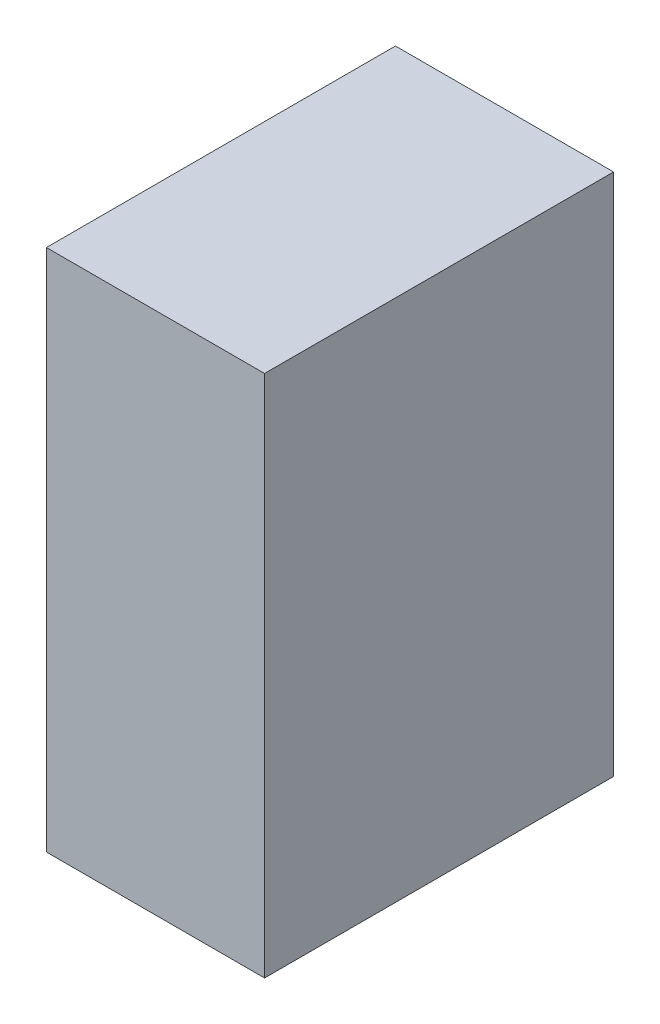
ISO-10303-21;
HEADER;
FILE_DESCRIPTION(('STEP AP214'),'2;1');
FILE_NAME('part.step','',(''),(''),'','','');
FILE_SCHEMA(('AUTOMOTIVE_DESIGN { 1 0 10303 214 1 1 1 1 }'));
ENDSEC;
DATA;
#1=APPLICATION_CONTEXT('core data for automotive mechanical design processes');
#2=APPLICATION_PROTOCOL_DEFINITION('international standard','automotive_design',2000,#1);
#3=PRODUCT_CONTEXT('',#1,'mechanical');
#4=PRODUCT('Part','Part','',(#3));
#5=PRODUCT_RELATED_PRODUCT_CATEGORY('part','',(#4));
#6=PRODUCT_DEFINITION_FORMATION('','',#4);
#7=PRODUCT_DEFINITION_CONTEXT('part definition',#1,'design');
#8=PRODUCT_DEFINITION('design','',#6,#7);
#9=PRODUCT_DEFINITION_SHAPE('','',#8);
#10=(LENGTH_UNIT() NAMED_UNIT(*) SI_UNIT(.MILLI.,.METRE.));
#11=(NAMED_UNIT(*) PLANE_ANGLE_UNIT() SI_UNIT($,.RADIAN.));
#12=(NAMED_UNIT(*) SI_UNIT($,.STERADIAN.) SOLID_ANGLE_UNIT());
#13=UNCERTAINTY_MEASURE_WITH_UNIT(LENGTH_MEASURE(1.E-05),#10,'distance_accuracy_value','');
#14=(GEOMETRIC_REPRESENTATION_CONTEXT(3) GLOBAL_UNCERTAINTY_ASSIGNED_CONTEXT((#13)) GLOBAL_UNIT_ASSIGNED_CONTEXT((#10,
#11,#12)) REPRESENTATION_CONTEXT('',''));
#15=CARTESIAN_POINT('',(0.,0.,0.));
#16=DIRECTION('',(0.,0.,1.));
#17=DIRECTION('',(1.,0.,0.));
#18=AXIS2_PLACEMENT_3D('',#15,#16,#17);
#19=CARTESIAN_POINT('',(0.,0.,0.4));
#20=DIRECTION('',(0.,1.,0.));
#21=DIRECTION('',(0.,0.,1.));
#22=AXIS2_PLACEMENT_3D('',#19,#20,#21);
#23=PLANE('',#22);
#24=DIRECTION('',(1.,0.,0.));
#25=VECTOR('',#24,1.);
#26=CARTESIAN_POINT('',(0.,0.,0.));
#27=LINE('',#26,#25);
#28=CARTESIAN_POINT('',(0.,0.,0.));
#29=VERTEX_POINT('',#28);
#30=CARTESIAN_POINT('',(0.25,0.,0.));
#31=VERTEX_POINT('',#30);
#32=EDGE_CURVE('E98',#29,#31,#27,.T.);
#33=ORIENTED_EDGE('',*,*,#32,.T.);
#34=DIRECTION('',(0.,0.,-1.));
#35=VECTOR('',#34,1.);
#36=CARTESIAN_POINT('',(0.25,0.,0.4));
#37=LINE('',#36,#35);
#38=CARTESIAN_POINT('',(0.25,0.,0.4));
#39=VERTEX_POINT('',#38);
#40=EDGE_CURVE('E11',#39,#31,#37,.T.);
#41=ORIENTED_EDGE('',*,*,#40,.F.);
#42=DIRECTION('',(1.,0.,0.));
#43=VECTOR('',#42,1.);
#44=CARTESIAN_POINT('',(0.,0.,0.4));
#45=LINE('',#44,#43);
#46=CARTESIAN_POINT('',(0.,0.,0.4));
#47=VERTEX_POINT('',#46);
#48=EDGE_CURVE('E84',#47,#39,#45,.T.);
#49=ORIENTED_EDGE('',*,*,#48,.F.);
#50=DIRECTION('',(0.,0.,-1.));
#51=VECTOR('',#50,1.);
#52=CARTESIAN_POINT('',(0.,0.,0.4));
#53=LINE('',#52,#51);
#54=EDGE_CURVE('E51',#47,#29,#53,.T.);
#55=ORIENTED_EDGE('',*,*,#54,.T.);
#56=EDGE_LOOP('',(#33,#41,#49,#55));
#57=FACE_BOUND('',#56,.T.);
#58=ADVANCED_FACE('F35',(#57),#23,.F.);
#59=CARTESIAN_POINT('',(0.25,0.,0.4));
#60=DIRECTION('',(-1.,0.,0.));
#61=DIRECTION('',(0.,0.,1.));
#62=AXIS2_PLACEMENT_3D('',#59,#60,#61);
#63=PLANE('',#62);
#64=DIRECTION('',(0.,1.,0.));
#65=VECTOR('',#64,1.);
#66=CARTESIAN_POINT('',(0.25,0.,0.));
#67=LINE('',#66,#65);
#68=CARTESIAN_POINT('',(0.25,0.6,0.));
#69=VERTEX_POINT('',#68);
#70=EDGE_CURVE('E89',#31,#69,#67,.T.);
#71=ORIENTED_EDGE('',*,*,#70,.T.);
#72=DIRECTION('',(0.,0.,-1.));
#73=VECTOR('',#72,1.);
#74=CARTESIAN_POINT('',(0.25,0.6,0.4));
#75=LINE('',#74,#73);
#76=CARTESIAN_POINT('',(0.25,0.6,0.4));
#77=VERTEX_POINT('',#76);
#78=EDGE_CURVE('E43',#77,#69,#75,.T.);
#79=ORIENTED_EDGE('',*,*,#78,.F.);
#80=DIRECTION('',(0.,1.,0.));
#81=VECTOR('',#80,1.);
#82=CARTESIAN_POINT('',(0.25,0.,0.4));
#83=LINE('',#82,#81);
#84=EDGE_CURVE('E76',#39,#77,#83,.T.);
#85=ORIENTED_EDGE('',*,*,#84,.F.);
#86=ORIENTED_EDGE('',*,*,#40,.T.);
#87=EDGE_LOOP('',(#71,#79,#85,#86));
#88=FACE_BOUND('',#87,.T.);
#89=ADVANCED_FACE('F88',(#88),#63,.F.);
#90=CARTESIAN_POINT('',(0.,0.6,0.4));
#91=DIRECTION('',(0.,1.,0.));
#92=DIRECTION('',(0.,0.,1.));
#93=AXIS2_PLACEMENT_3D('',#90,#91,#92);
#94=PLANE('',#93);
#95=DIRECTION('',(1.,0.,0.));
#96=VECTOR('',#95,1.);
#97=CARTESIAN_POINT('',(0.,0.6,0.));
#98=LINE('',#97,#96);
#99=CARTESIAN_POINT('',(0.,0.6,0.));
#100=VERTEX_POINT('',#99);
#101=EDGE_CURVE('E101',#100,#69,#98,.T.);
#102=ORIENTED_EDGE('',*,*,#101,.F.);
#103=DIRECTION('',(0.,0.,-1.));
#104=VECTOR('',#103,1.);
#105=CARTESIAN_POINT('',(0.,0.6,0.4));
#106=LINE('',#105,#104);
#107=CARTESIAN_POINT('',(0.,0.6,0.4));
#108=VERTEX_POINT('',#107);
#109=EDGE_CURVE('E65',#108,#100,#106,.T.);
#110=ORIENTED_EDGE('',*,*,#109,.F.);
#111=DIRECTION('',(1.,0.,0.));
#112=VECTOR('',#111,1.);
#113=CARTESIAN_POINT('',(0.,0.6,0.4));
#114=LINE('',#113,#112);
#115=EDGE_CURVE('E83',#108,#77,#114,.T.);
#116=ORIENTED_EDGE('',*,*,#115,.T.);
#117=ORIENTED_EDGE('',*,*,#78,.T.);
#118=EDGE_LOOP('',(#102,#110,#116,#117));
#119=FACE_BOUND('',#118,.T.);
#120=ADVANCED_FACE('F92',(#119),#94,.T.);
#121=CARTESIAN_POINT('',(0.,0.,0.4));
#122=DIRECTION('',(-1.,0.,0.));
#123=DIRECTION('',(0.,0.,1.));
#124=AXIS2_PLACEMENT_3D('',#121,#122,#123);
#125=PLANE('',#124);
#126=DIRECTION('',(0.,1.,0.));
#127=VECTOR('',#126,1.);
#128=CARTESIAN_POINT('',(0.,0.,0.));
#129=LINE('',#128,#127);
#130=EDGE_CURVE('E103',#29,#100,#129,.T.);
#131=ORIENTED_EDGE('',*,*,#130,.F.);
#132=ORIENTED_EDGE('',*,*,#54,.F.);
#133=DIRECTION('',(0.,1.,0.));
#134=VECTOR('',#133,1.);
#135=CARTESIAN_POINT('',(0.,0.,0.4));
#136=LINE('',#135,#134);
#137=EDGE_CURVE('E93',#47,#108,#136,.T.);
#138=ORIENTED_EDGE('',*,*,#137,.T.);
#139=ORIENTED_EDGE('',*,*,#109,.T.);
#140=EDGE_LOOP('',(#131,#132,#138,#139));
#141=FACE_BOUND('',#140,.T.);
#142=ADVANCED_FACE('F109',(#141),#125,.T.);
#143=CARTESIAN_POINT('',(0.,0.,0.4));
#144=DIRECTION('',(0.,0.,1.));
#145=DIRECTION('',(1.,0.,0.));
#146=AXIS2_PLACEMENT_3D('',#143,#144,#145);
#147=PLANE('',#146);
#148=ORIENTED_EDGE('',*,*,#48,.T.);
#149=ORIENTED_EDGE('',*,*,#84,.T.);
#150=ORIENTED_EDGE('',*,*,#115,.F.);
#151=ORIENTED_EDGE('',*,*,#137,.F.);
#152=EDGE_LOOP('',(#148,#149,#150,#151));
#153=FACE_BOUND('',#152,.T.);
#154=ADVANCED_FACE('F80',(#153),#147,.T.);
#155=CARTESIAN_POINT('',(0.,0.,0.));
#156=DIRECTION('',(0.,0.,1.));
#157=DIRECTION('',(1.,0.,0.));
#158=AXIS2_PLACEMENT_3D('',#155,#156,#157);
#159=PLANE('',#158);
#160=ORIENTED_EDGE('',*,*,#32,.F.);
#161=ORIENTED_EDGE('',*,*,#130,.T.);
#162=ORIENTED_EDGE('',*,*,#101,.T.);
#163=ORIENTED_EDGE('',*,*,#70,.F.);
#164=EDGE_LOOP('',(#160,#161,#162,#163));
#165=FACE_BOUND('',#164,.T.);
#166=ADVANCED_FACE('F108',(#165),#159,.F.);
#167=CLOSED_SHELL('',(#58,#89,#120,#142,#154,#166));
#168=MANIFOLD_SOLID_BREP('B2',#167);
#169=ADVANCED_BREP_SHAPE_REPRESENTATION('',(#18,#168),#14);
#170=SHAPE_DEFINITION_REPRESENTATION(#9,#169);
ENDSEC;
END-ISO-10303-21;
